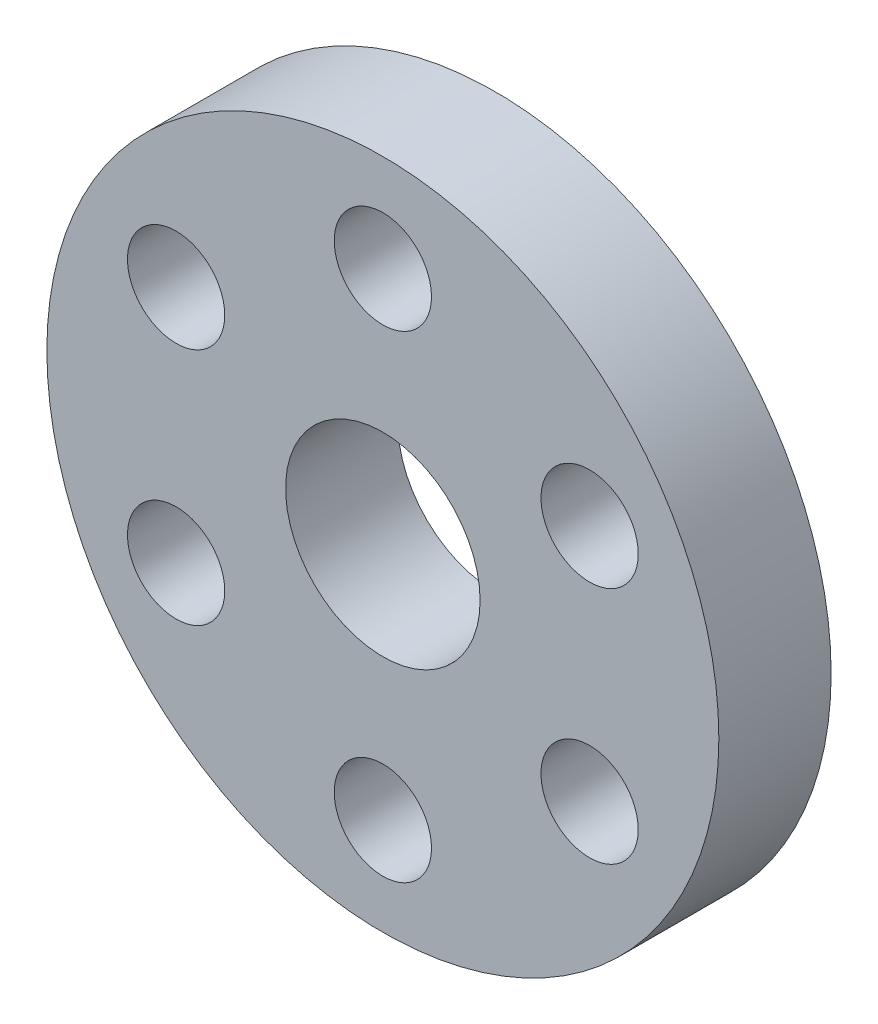
ISO-10303-21;
HEADER;
FILE_DESCRIPTION(('STEP AP214'),'2;1');
FILE_NAME('part.step','',(''),(''),'','','');
FILE_SCHEMA(('AUTOMOTIVE_DESIGN { 1 0 10303 214 1 1 1 1 }'));
ENDSEC;
DATA;
#1=APPLICATION_CONTEXT('core data for automotive mechanical design processes');
#2=APPLICATION_PROTOCOL_DEFINITION('international standard','automotive_design',2000,#1);
#3=PRODUCT_CONTEXT('',#1,'mechanical');
#4=PRODUCT('Part','Part','',(#3));
#5=PRODUCT_RELATED_PRODUCT_CATEGORY('part','',(#4));
#6=PRODUCT_DEFINITION_FORMATION('','',#4);
#7=PRODUCT_DEFINITION_CONTEXT('part definition',#1,'design');
#8=PRODUCT_DEFINITION('design','',#6,#7);
#9=PRODUCT_DEFINITION_SHAPE('','',#8);
#10=(LENGTH_UNIT() NAMED_UNIT(*) SI_UNIT(.MILLI.,.METRE.));
#11=(NAMED_UNIT(*) PLANE_ANGLE_UNIT() SI_UNIT($,.RADIAN.));
#12=(NAMED_UNIT(*) SI_UNIT($,.STERADIAN.) SOLID_ANGLE_UNIT());
#13=UNCERTAINTY_MEASURE_WITH_UNIT(LENGTH_MEASURE(1.E-05),#10,'distance_accuracy_value','');
#14=(GEOMETRIC_REPRESENTATION_CONTEXT(3) GLOBAL_UNCERTAINTY_ASSIGNED_CONTEXT((#13)) GLOBAL_UNIT_ASSIGNED_CONTEXT((#10,
#11,#12)) REPRESENTATION_CONTEXT('',''));
#15=CARTESIAN_POINT('',(0.,0.,0.));
#16=DIRECTION('',(0.,0.,1.));
#17=DIRECTION('',(1.,0.,0.));
#18=AXIS2_PLACEMENT_3D('',#15,#16,#17);
#19=CARTESIAN_POINT('',(0.,0.,6.35));
#20=DIRECTION('',(0.,0.,1.));
#21=DIRECTION('',(1.,0.,0.));
#22=AXIS2_PLACEMENT_3D('',#19,#20,#21);
#23=PLANE('',#22);
#24=CARTESIAN_POINT('',(0.,13.5,6.35));
#25=DIRECTION('',(0.,0.,1.));
#26=DIRECTION('',(1.,0.,0.));
#27=AXIS2_PLACEMENT_3D('',#24,#25,#26);
#28=CIRCLE('',#27,2.75);
#29=CARTESIAN_POINT('',(2.75,13.5,6.35));
#30=VERTEX_POINT('',#29);
#31=EDGE_CURVE('E46',#30,#30,#28,.T.);
#32=ORIENTED_EDGE('',*,*,#31,.F.);
#33=EDGE_LOOP('',(#32));
#34=FACE_BOUND('',#33,.T.);
#35=CARTESIAN_POINT('',(-11.6913429510896,6.7499999999995,6.35));
#36=DIRECTION('',(0.,0.,1.));
#37=DIRECTION('',(1.,0.,0.));
#38=AXIS2_PLACEMENT_3D('',#35,#36,#37);
#39=CIRCLE('',#38,2.75000000000058);
#40=CARTESIAN_POINT('',(-8.94134295108906,6.7499999999995,6.35));
#41=VERTEX_POINT('',#40);
#42=EDGE_CURVE('E56',#41,#41,#39,.T.);
#43=ORIENTED_EDGE('',*,*,#42,.F.);
#44=EDGE_LOOP('',(#43));
#45=FACE_BOUND('',#44,.T.);
#46=CARTESIAN_POINT('',(-11.6913429510891,-6.7500000000005,6.35));
#47=DIRECTION('',(0.,0.,1.));
#48=DIRECTION('',(1.,0.,0.));
#49=AXIS2_PLACEMENT_3D('',#46,#47,#48);
#50=CIRCLE('',#49,2.75000000000109);
#51=CARTESIAN_POINT('',(-8.94134295108797,-6.7500000000005,6.35));
#52=VERTEX_POINT('',#51);
#53=EDGE_CURVE('E49',#52,#52,#50,.T.);
#54=ORIENTED_EDGE('',*,*,#53,.F.);
#55=EDGE_LOOP('',(#54));
#56=FACE_BOUND('',#55,.T.);
#57=CARTESIAN_POINT('',(1.14611941239482E-12,-13.5,6.35));
#58=DIRECTION('',(0.,0.,1.));
#59=DIRECTION('',(1.,0.,0.));
#60=AXIS2_PLACEMENT_3D('',#57,#58,#59);
#61=CIRCLE('',#60,2.75000000000119);
#62=CARTESIAN_POINT('',(2.75000000000233,-13.5,6.35));
#63=VERTEX_POINT('',#62);
#64=EDGE_CURVE('E57',#63,#63,#61,.T.);
#65=ORIENTED_EDGE('',*,*,#64,.F.);
#66=EDGE_LOOP('',(#65));
#67=FACE_BOUND('',#66,.T.);
#68=CARTESIAN_POINT('',(11.6913429510908,-6.7499999999995,6.35));
#69=DIRECTION('',(0.,0.,1.));
#70=DIRECTION('',(1.,0.,0.));
#71=AXIS2_PLACEMENT_3D('',#68,#69,#70);
#72=CIRCLE('',#71,2.75000000000074);
#73=CARTESIAN_POINT('',(14.4413429510915,-6.7499999999995,6.35));
#74=VERTEX_POINT('',#73);
#75=EDGE_CURVE('E63',#74,#74,#72,.T.);
#76=ORIENTED_EDGE('',*,*,#75,.F.);
#77=EDGE_LOOP('',(#76));
#78=FACE_BOUND('',#77,.T.);
#79=CARTESIAN_POINT('',(11.6913429510902,6.7500000000005,6.35));
#80=DIRECTION('',(0.,0.,1.));
#81=DIRECTION('',(1.,0.,0.));
#82=AXIS2_PLACEMENT_3D('',#79,#80,#81);
#83=CIRCLE('',#82,2.75000000000016);
#84=CARTESIAN_POINT('',(14.4413429510904,6.7500000000005,6.35));
#85=VERTEX_POINT('',#84);
#86=EDGE_CURVE('E69',#85,#85,#83,.T.);
#87=ORIENTED_EDGE('',*,*,#86,.F.);
#88=EDGE_LOOP('',(#87));
#89=FACE_BOUND('',#88,.T.);
#90=CARTESIAN_POINT('',(0.,0.,6.35));
#91=DIRECTION('',(0.,0.,1.));
#92=DIRECTION('',(1.,0.,0.));
#93=AXIS2_PLACEMENT_3D('',#90,#91,#92);
#94=CIRCLE('',#93,19.);
#95=CARTESIAN_POINT('',(19.,0.,6.35));
#96=VERTEX_POINT('',#95);
#97=EDGE_CURVE('E10',#96,#96,#94,.T.);
#98=ORIENTED_EDGE('',*,*,#97,.T.);
#99=EDGE_LOOP('',(#98));
#100=FACE_BOUND('',#99,.T.);
#101=CARTESIAN_POINT('',(0.,0.,6.35));
#102=DIRECTION('',(0.,0.,1.));
#103=DIRECTION('',(1.,0.,0.));
#104=AXIS2_PLACEMENT_3D('',#101,#102,#103);
#105=CIRCLE('',#104,5.5);
#106=CARTESIAN_POINT('',(5.5,0.,6.35));
#107=VERTEX_POINT('',#106);
#108=EDGE_CURVE('E41',#107,#107,#105,.T.);
#109=ORIENTED_EDGE('',*,*,#108,.F.);
#110=EDGE_LOOP('',(#109));
#111=FACE_BOUND('',#110,.T.);
#112=ADVANCED_FACE('F30',(#34,#45,#56,#67,#78,#89,#100,#111),#23,.T.);
#113=CARTESIAN_POINT('',(0.,0.,0.));
#114=DIRECTION('',(0.,0.,1.));
#115=DIRECTION('',(1.,0.,0.));
#116=AXIS2_PLACEMENT_3D('',#113,#114,#115);
#117=PLANE('',#116);
#118=CARTESIAN_POINT('',(0.,13.5,0.));
#119=DIRECTION('',(0.,0.,1.));
#120=DIRECTION('',(1.,0.,0.));
#121=AXIS2_PLACEMENT_3D('',#118,#119,#120);
#122=CIRCLE('',#121,2.75);
#123=CARTESIAN_POINT('',(2.75,13.5,0.));
#124=VERTEX_POINT('',#123);
#125=EDGE_CURVE('E72',#124,#124,#122,.T.);
#126=ORIENTED_EDGE('',*,*,#125,.T.);
#127=EDGE_LOOP('',(#126));
#128=FACE_BOUND('',#127,.T.);
#129=CARTESIAN_POINT('',(-11.6913429510896,6.7499999999995,0.));
#130=DIRECTION('',(0.,0.,1.));
#131=DIRECTION('',(1.,0.,0.));
#132=AXIS2_PLACEMENT_3D('',#129,#130,#131);
#133=CIRCLE('',#132,2.75000000000058);
#134=CARTESIAN_POINT('',(-8.94134295108906,6.7499999999995,0.));
#135=VERTEX_POINT('',#134);
#136=EDGE_CURVE('E77',#135,#135,#133,.T.);
#137=ORIENTED_EDGE('',*,*,#136,.T.);
#138=EDGE_LOOP('',(#137));
#139=FACE_BOUND('',#138,.T.);
#140=CARTESIAN_POINT('',(-11.6913429510891,-6.7500000000005,0.));
#141=DIRECTION('',(0.,0.,1.));
#142=DIRECTION('',(1.,0.,0.));
#143=AXIS2_PLACEMENT_3D('',#140,#141,#142);
#144=CIRCLE('',#143,2.75000000000109);
#145=CARTESIAN_POINT('',(-8.94134295108797,-6.7500000000005,0.));
#146=VERTEX_POINT('',#145);
#147=EDGE_CURVE('E53',#146,#146,#144,.T.);
#148=ORIENTED_EDGE('',*,*,#147,.T.);
#149=EDGE_LOOP('',(#148));
#150=FACE_BOUND('',#149,.T.);
#151=CARTESIAN_POINT('',(1.14611941239482E-12,-13.5,0.));
#152=DIRECTION('',(0.,0.,1.));
#153=DIRECTION('',(1.,0.,0.));
#154=AXIS2_PLACEMENT_3D('',#151,#152,#153);
#155=CIRCLE('',#154,2.75000000000119);
#156=CARTESIAN_POINT('',(2.75000000000233,-13.5,0.));
#157=VERTEX_POINT('',#156);
#158=EDGE_CURVE('E52',#157,#157,#155,.T.);
#159=ORIENTED_EDGE('',*,*,#158,.T.);
#160=EDGE_LOOP('',(#159));
#161=FACE_BOUND('',#160,.T.);
#162=CARTESIAN_POINT('',(11.6913429510908,-6.7499999999995,0.));
#163=DIRECTION('',(0.,0.,1.));
#164=DIRECTION('',(1.,0.,0.));
#165=AXIS2_PLACEMENT_3D('',#162,#163,#164);
#166=CIRCLE('',#165,2.75000000000074);
#167=CARTESIAN_POINT('',(14.4413429510915,-6.7499999999995,0.));
#168=VERTEX_POINT('',#167);
#169=EDGE_CURVE('E60',#168,#168,#166,.T.);
#170=ORIENTED_EDGE('',*,*,#169,.T.);
#171=EDGE_LOOP('',(#170));
#172=FACE_BOUND('',#171,.T.);
#173=CARTESIAN_POINT('',(11.6913429510902,6.7500000000005,0.));
#174=DIRECTION('',(0.,0.,1.));
#175=DIRECTION('',(1.,0.,0.));
#176=AXIS2_PLACEMENT_3D('',#173,#174,#175);
#177=CIRCLE('',#176,2.75000000000016);
#178=CARTESIAN_POINT('',(14.4413429510904,6.7500000000005,0.));
#179=VERTEX_POINT('',#178);
#180=EDGE_CURVE('E66',#179,#179,#177,.T.);
#181=ORIENTED_EDGE('',*,*,#180,.T.);
#182=EDGE_LOOP('',(#181));
#183=FACE_BOUND('',#182,.T.);
#184=CARTESIAN_POINT('',(0.,0.,0.));
#185=DIRECTION('',(0.,0.,1.));
#186=DIRECTION('',(1.,0.,0.));
#187=AXIS2_PLACEMENT_3D('',#184,#185,#186);
#188=CIRCLE('',#187,19.);
#189=CARTESIAN_POINT('',(19.,0.,0.));
#190=VERTEX_POINT('',#189);
#191=EDGE_CURVE('E34',#190,#190,#188,.T.);
#192=ORIENTED_EDGE('',*,*,#191,.F.);
#193=EDGE_LOOP('',(#192));
#194=FACE_BOUND('',#193,.T.);
#195=CARTESIAN_POINT('',(0.,0.,0.));
#196=DIRECTION('',(0.,0.,1.));
#197=DIRECTION('',(1.,0.,0.));
#198=AXIS2_PLACEMENT_3D('',#195,#196,#197);
#199=CIRCLE('',#198,5.5);
#200=CARTESIAN_POINT('',(5.5,0.,0.));
#201=VERTEX_POINT('',#200);
#202=EDGE_CURVE('E43',#201,#201,#199,.T.);
#203=ORIENTED_EDGE('',*,*,#202,.T.);
#204=EDGE_LOOP('',(#203));
#205=FACE_BOUND('',#204,.T.);
#206=ADVANCED_FACE('F85',(#128,#139,#150,#161,#172,#183,#194,#205),#117,.F.);
#207=CARTESIAN_POINT('',(0.,0.,6.35));
#208=DIRECTION('',(0.,0.,-1.));
#209=DIRECTION('',(-1.,0.,0.));
#210=AXIS2_PLACEMENT_3D('',#207,#208,#209);
#211=CYLINDRICAL_SURFACE('',#210,19.);
#212=ORIENTED_EDGE('',*,*,#97,.F.);
#213=EDGE_LOOP('',(#212));
#214=FACE_BOUND('',#213,.T.);
#215=ORIENTED_EDGE('',*,*,#191,.T.);
#216=EDGE_LOOP('',(#215));
#217=FACE_BOUND('',#216,.T.);
#218=ADVANCED_FACE('F32',(#214,#217),#211,.T.);
#219=CARTESIAN_POINT('',(0.,0.,6.35));
#220=DIRECTION('',(0.,0.,-1.));
#221=DIRECTION('',(-1.,0.,0.));
#222=AXIS2_PLACEMENT_3D('',#219,#220,#221);
#223=CYLINDRICAL_SURFACE('',#222,5.5);
#224=ORIENTED_EDGE('',*,*,#108,.T.);
#225=EDGE_LOOP('',(#224));
#226=FACE_BOUND('',#225,.T.);
#227=ORIENTED_EDGE('',*,*,#202,.F.);
#228=EDGE_LOOP('',(#227));
#229=FACE_BOUND('',#228,.T.);
#230=ADVANCED_FACE('F110',(#226,#229),#223,.F.);
#231=CARTESIAN_POINT('',(11.6913429510902,6.7500000000005,14.1281745930554));
#232=DIRECTION('',(0.,0.,-1.));
#233=DIRECTION('',(-1.,0.,0.));
#234=AXIS2_PLACEMENT_3D('',#231,#232,#233);
#235=CYLINDRICAL_SURFACE('',#234,2.75000000000016);
#236=ORIENTED_EDGE('',*,*,#180,.F.);
#237=EDGE_LOOP('',(#236));
#238=FACE_BOUND('',#237,.T.);
#239=ORIENTED_EDGE('',*,*,#86,.T.);
#240=EDGE_LOOP('',(#239));
#241=FACE_BOUND('',#240,.T.);
#242=ADVANCED_FACE('F113',(#238,#241),#235,.F.);
#243=CARTESIAN_POINT('',(11.6913429510908,-6.7499999999995,14.1281745930554));
#244=DIRECTION('',(0.,0.,-1.));
#245=DIRECTION('',(-1.,0.,0.));
#246=AXIS2_PLACEMENT_3D('',#243,#244,#245);
#247=CYLINDRICAL_SURFACE('',#246,2.75000000000074);
#248=ORIENTED_EDGE('',*,*,#169,.F.);
#249=EDGE_LOOP('',(#248));
#250=FACE_BOUND('',#249,.T.);
#251=ORIENTED_EDGE('',*,*,#75,.T.);
#252=EDGE_LOOP('',(#251));
#253=FACE_BOUND('',#252,.T.);
#254=ADVANCED_FACE('F130',(#250,#253),#247,.F.);
#255=CARTESIAN_POINT('',(1.14611941239482E-12,-13.5,14.1281745930554));
#256=DIRECTION('',(0.,0.,-1.));
#257=DIRECTION('',(-1.,0.,0.));
#258=AXIS2_PLACEMENT_3D('',#255,#256,#257);
#259=CYLINDRICAL_SURFACE('',#258,2.75000000000119);
#260=ORIENTED_EDGE('',*,*,#158,.F.);
#261=EDGE_LOOP('',(#260));
#262=FACE_BOUND('',#261,.T.);
#263=ORIENTED_EDGE('',*,*,#64,.T.);
#264=EDGE_LOOP('',(#263));
#265=FACE_BOUND('',#264,.T.);
#266=ADVANCED_FACE('F126',(#262,#265),#259,.F.);
#267=CARTESIAN_POINT('',(-11.6913429510891,-6.7500000000005,14.1281745930554));
#268=DIRECTION('',(0.,0.,-1.));
#269=DIRECTION('',(-1.,0.,0.));
#270=AXIS2_PLACEMENT_3D('',#267,#268,#269);
#271=CYLINDRICAL_SURFACE('',#270,2.75000000000109);
#272=ORIENTED_EDGE('',*,*,#147,.F.);
#273=EDGE_LOOP('',(#272));
#274=FACE_BOUND('',#273,.T.);
#275=ORIENTED_EDGE('',*,*,#53,.T.);
#276=EDGE_LOOP('',(#275));
#277=FACE_BOUND('',#276,.T.);
#278=ADVANCED_FACE('F123',(#274,#277),#271,.F.);
#279=CARTESIAN_POINT('',(-11.6913429510896,6.7499999999995,14.1281745930554));
#280=DIRECTION('',(0.,0.,-1.));
#281=DIRECTION('',(-1.,0.,0.));
#282=AXIS2_PLACEMENT_3D('',#279,#280,#281);
#283=CYLINDRICAL_SURFACE('',#282,2.75000000000058);
#284=ORIENTED_EDGE('',*,*,#136,.F.);
#285=EDGE_LOOP('',(#284));
#286=FACE_BOUND('',#285,.T.);
#287=ORIENTED_EDGE('',*,*,#42,.T.);
#288=EDGE_LOOP('',(#287));
#289=FACE_BOUND('',#288,.T.);
#290=ADVANCED_FACE('F91',(#286,#289),#283,.F.);
#291=CARTESIAN_POINT('',(0.,13.5,14.1281745930554));
#292=DIRECTION('',(0.,0.,-1.));
#293=DIRECTION('',(-1.,0.,0.));
#294=AXIS2_PLACEMENT_3D('',#291,#292,#293);
#295=CYLINDRICAL_SURFACE('',#294,2.75);
#296=ORIENTED_EDGE('',*,*,#125,.F.);
#297=EDGE_LOOP('',(#296));
#298=FACE_BOUND('',#297,.T.);
#299=ORIENTED_EDGE('',*,*,#31,.T.);
#300=EDGE_LOOP('',(#299));
#301=FACE_BOUND('',#300,.T.);
#302=ADVANCED_FACE('F88',(#298,#301),#295,.F.);
#303=CLOSED_SHELL('',(#112,#206,#218,#230,#242,#254,#266,#278,#290,#302));
#304=MANIFOLD_SOLID_BREP('B2',#303);
#305=ADVANCED_BREP_SHAPE_REPRESENTATION('',(#18,#304),#14);
#306=SHAPE_DEFINITION_REPRESENTATION(#9,#305);
ENDSEC;
END-ISO-10303-21;
